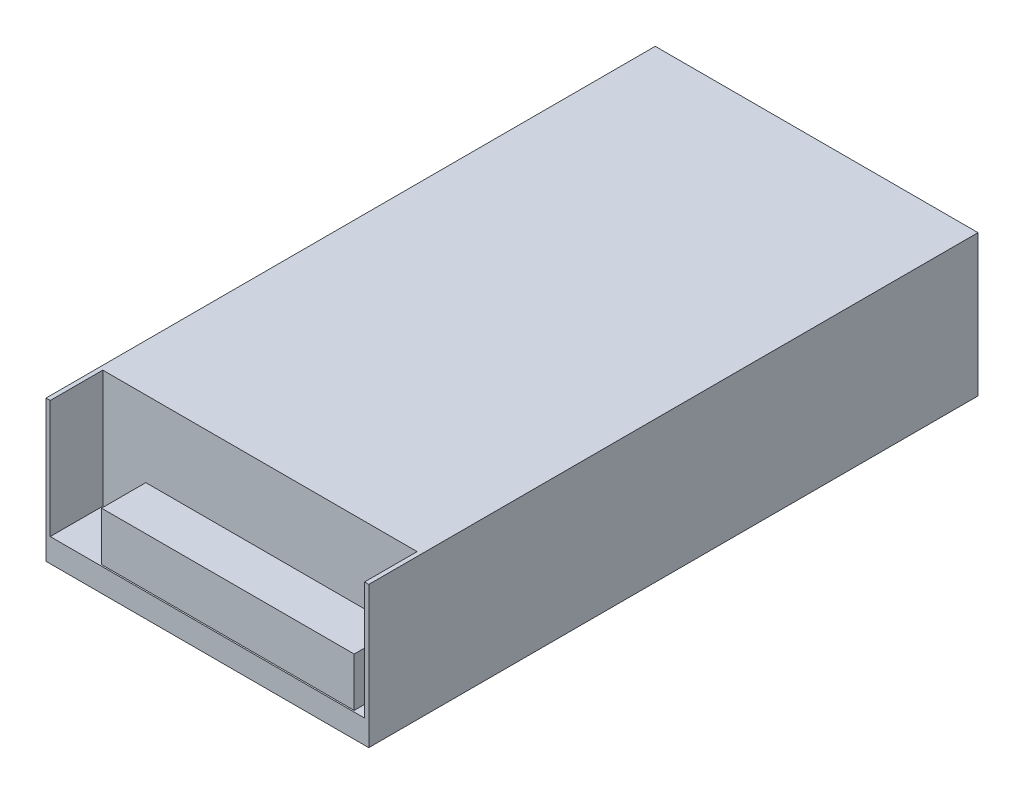
ISO-10303-21;
HEADER;
FILE_DESCRIPTION(('STEP AP214'),'2;1');
FILE_NAME('part.step','',(''),(''),'','','');
FILE_SCHEMA(('AUTOMOTIVE_DESIGN { 1 0 10303 214 1 1 1 1 }'));
ENDSEC;
DATA;
#1=APPLICATION_CONTEXT('core data for automotive mechanical design processes');
#2=APPLICATION_PROTOCOL_DEFINITION('international standard','automotive_design',2000,#1);
#3=PRODUCT_CONTEXT('',#1,'mechanical');
#4=PRODUCT('Part','Part','',(#3));
#5=PRODUCT_RELATED_PRODUCT_CATEGORY('part','',(#4));
#6=PRODUCT_DEFINITION_FORMATION('','',#4);
#7=PRODUCT_DEFINITION_CONTEXT('part definition',#1,'design');
#8=PRODUCT_DEFINITION('design','',#6,#7);
#9=PRODUCT_DEFINITION_SHAPE('','',#8);
#10=(LENGTH_UNIT() NAMED_UNIT(*) SI_UNIT(.MILLI.,.METRE.));
#11=(NAMED_UNIT(*) PLANE_ANGLE_UNIT() SI_UNIT($,.RADIAN.));
#12=(NAMED_UNIT(*) SI_UNIT($,.STERADIAN.) SOLID_ANGLE_UNIT());
#13=UNCERTAINTY_MEASURE_WITH_UNIT(LENGTH_MEASURE(1.E-05),#10,'distance_accuracy_value','');
#14=(GEOMETRIC_REPRESENTATION_CONTEXT(3) GLOBAL_UNCERTAINTY_ASSIGNED_CONTEXT((#13)) GLOBAL_UNIT_ASSIGNED_CONTEXT((#10,
#11,#12)) REPRESENTATION_CONTEXT('',''));
#15=CARTESIAN_POINT('',(0.,0.,0.));
#16=DIRECTION('',(0.,0.,1.));
#17=DIRECTION('',(1.,0.,0.));
#18=AXIS2_PLACEMENT_3D('',#15,#16,#17);
#19=CARTESIAN_POINT('',(0.,8.255,0.));
#20=DIRECTION('',(0.,-1.,0.));
#21=DIRECTION('',(0.,0.,-1.));
#22=AXIS2_PLACEMENT_3D('',#19,#20,#21);
#23=PLANE('',#22);
#24=DIRECTION('',(0.,0.,1.));
#25=VECTOR('',#24,1.);
#26=CARTESIAN_POINT('',(1.4732,8.255,0.));
#27=LINE('',#26,#25);
#28=CARTESIAN_POINT('',(1.4732,8.255,-18.415));
#29=VERTEX_POINT('',#28);
#30=CARTESIAN_POINT('',(1.4732,8.255,0.));
#31=VERTEX_POINT('',#30);
#32=EDGE_CURVE('E151',#29,#31,#27,.T.);
#33=ORIENTED_EDGE('',*,*,#32,.T.);
#34=DIRECTION('',(1.,0.,0.));
#35=VECTOR('',#34,1.);
#36=CARTESIAN_POINT('',(1.4732,8.255,0.));
#37=LINE('',#36,#35);
#38=CARTESIAN_POINT('',(111.5568,8.255,0.));
#39=VERTEX_POINT('',#38);
#40=EDGE_CURVE('E154',#31,#39,#37,.T.);
#41=ORIENTED_EDGE('',*,*,#40,.T.);
#42=DIRECTION('',(0.,0.,-1.));
#43=VECTOR('',#42,1.);
#44=CARTESIAN_POINT('',(111.5568,8.255,0.));
#45=LINE('',#44,#43);
#46=CARTESIAN_POINT('',(111.5568,8.255,-18.415));
#47=VERTEX_POINT('',#46);
#48=EDGE_CURVE('E158',#39,#47,#45,.T.);
#49=ORIENTED_EDGE('',*,*,#48,.T.);
#50=DIRECTION('',(-1.,0.,0.));
#51=VECTOR('',#50,1.);
#52=CARTESIAN_POINT('',(1.4732,8.255,-18.415));
#53=LINE('',#52,#51);
#54=EDGE_CURVE('E161',#47,#29,#53,.T.);
#55=ORIENTED_EDGE('',*,*,#54,.T.);
#56=EDGE_LOOP('',(#33,#41,#49,#55));
#57=FACE_BOUND('',#56,.T.);
#58=DIRECTION('',(0.,0.,1.));
#59=VECTOR('',#58,1.);
#60=CARTESIAN_POINT('',(18.9484,8.255,-0.508));
#61=LINE('',#60,#59);
#62=CARTESIAN_POINT('',(18.9484,8.255,-16.002));
#63=VERTEX_POINT('',#62);
#64=CARTESIAN_POINT('',(18.9484,8.255,-0.508));
#65=VERTEX_POINT('',#64);
#66=EDGE_CURVE('E142',#63,#65,#61,.T.);
#67=ORIENTED_EDGE('',*,*,#66,.F.);
#68=DIRECTION('',(-1.,0.,0.));
#69=VECTOR('',#68,1.);
#70=CARTESIAN_POINT('',(18.9484,8.255,-16.002));
#71=LINE('',#70,#69);
#72=CARTESIAN_POINT('',(107.4166,8.255,-16.002));
#73=VERTEX_POINT('',#72);
#74=EDGE_CURVE('E139',#73,#63,#71,.T.);
#75=ORIENTED_EDGE('',*,*,#74,.F.);
#76=DIRECTION('',(0.,0.,-1.));
#77=VECTOR('',#76,1.);
#78=CARTESIAN_POINT('',(107.4166,8.255,-0.508));
#79=LINE('',#78,#77);
#80=CARTESIAN_POINT('',(107.4166,8.255,-0.508));
#81=VERTEX_POINT('',#80);
#82=EDGE_CURVE('E53',#81,#73,#79,.T.);
#83=ORIENTED_EDGE('',*,*,#82,.F.);
#84=DIRECTION('',(1.,0.,0.));
#85=VECTOR('',#84,1.);
#86=CARTESIAN_POINT('',(18.9484,8.255,-0.508));
#87=LINE('',#86,#85);
#88=EDGE_CURVE('E48',#65,#81,#87,.T.);
#89=ORIENTED_EDGE('',*,*,#88,.F.);
#90=EDGE_LOOP('',(#67,#75,#83,#89));
#91=FACE_BOUND('',#90,.T.);
#92=ADVANCED_FACE('F33',(#57,#91),#23,.F.);
#93=CARTESIAN_POINT('',(0.,49.53,0.));
#94=DIRECTION('',(1.,0.,0.));
#95=DIRECTION('',(0.,0.,-1.));
#96=AXIS2_PLACEMENT_3D('',#93,#94,#95);
#97=PLANE('',#96);
#98=DIRECTION('',(0.,0.,1.));
#99=VECTOR('',#98,1.);
#100=CARTESIAN_POINT('',(0.,0.,0.));
#101=LINE('',#100,#99);
#102=CARTESIAN_POINT('',(0.,0.,-213.36));
#103=VERTEX_POINT('',#102);
#104=CARTESIAN_POINT('',(0.,0.,0.));
#105=VERTEX_POINT('',#104);
#106=EDGE_CURVE('E171',#103,#105,#101,.T.);
#107=ORIENTED_EDGE('',*,*,#106,.T.);
#108=DIRECTION('',(0.,-1.,0.));
#109=VECTOR('',#108,1.);
#110=CARTESIAN_POINT('',(0.,49.53,0.));
#111=LINE('',#110,#109);
#112=CARTESIAN_POINT('',(0.,49.53,0.));
#113=VERTEX_POINT('',#112);
#114=EDGE_CURVE('E11',#113,#105,#111,.T.);
#115=ORIENTED_EDGE('',*,*,#114,.F.);
#116=DIRECTION('',(0.,0.,1.));
#117=VECTOR('',#116,1.);
#118=CARTESIAN_POINT('',(0.,49.53,0.));
#119=LINE('',#118,#117);
#120=CARTESIAN_POINT('',(0.,49.53,-213.36));
#121=VERTEX_POINT('',#120);
#122=EDGE_CURVE('E178',#121,#113,#119,.T.);
#123=ORIENTED_EDGE('',*,*,#122,.F.);
#124=DIRECTION('',(0.,-1.,0.));
#125=VECTOR('',#124,1.);
#126=CARTESIAN_POINT('',(0.,49.53,-213.36));
#127=LINE('',#126,#125);
#128=EDGE_CURVE('E190',#121,#103,#127,.T.);
#129=ORIENTED_EDGE('',*,*,#128,.T.);
#130=EDGE_LOOP('',(#107,#115,#123,#129));
#131=FACE_BOUND('',#130,.T.);
#132=ADVANCED_FACE('F35',(#131),#97,.F.);
#133=CARTESIAN_POINT('',(0.,49.53,0.));
#134=DIRECTION('',(0.,0.,-1.));
#135=DIRECTION('',(-1.,0.,0.));
#136=AXIS2_PLACEMENT_3D('',#133,#134,#135);
#137=PLANE('',#136);
#138=ORIENTED_EDGE('',*,*,#40,.F.);
#139=DIRECTION('',(0.,1.,0.));
#140=VECTOR('',#139,1.);
#141=CARTESIAN_POINT('',(1.4732,8.255,0.));
#142=LINE('',#141,#140);
#143=CARTESIAN_POINT('',(1.4732,49.53,0.));
#144=VERTEX_POINT('',#143);
#145=EDGE_CURVE('E163',#31,#144,#142,.T.);
#146=ORIENTED_EDGE('',*,*,#145,.T.);
#147=DIRECTION('',(1.,0.,0.));
#148=VECTOR('',#147,1.);
#149=CARTESIAN_POINT('',(0.,49.53,0.));
#150=LINE('',#149,#148);
#151=EDGE_CURVE('E183',#113,#144,#150,.T.);
#152=ORIENTED_EDGE('',*,*,#151,.F.);
#153=ORIENTED_EDGE('',*,*,#114,.T.);
#154=DIRECTION('',(1.,0.,0.));
#155=VECTOR('',#154,1.);
#156=CARTESIAN_POINT('',(0.,0.,0.));
#157=LINE('',#156,#155);
#158=CARTESIAN_POINT('',(113.03,0.,0.));
#159=VERTEX_POINT('',#158);
#160=EDGE_CURVE('E193',#105,#159,#157,.T.);
#161=ORIENTED_EDGE('',*,*,#160,.T.);
#162=DIRECTION('',(0.,-1.,0.));
#163=VECTOR('',#162,1.);
#164=CARTESIAN_POINT('',(113.03,49.53,0.));
#165=LINE('',#164,#163);
#166=CARTESIAN_POINT('',(113.03,49.53,0.));
#167=VERTEX_POINT('',#166);
#168=EDGE_CURVE('E41',#167,#159,#165,.T.);
#169=ORIENTED_EDGE('',*,*,#168,.F.);
#170=CARTESIAN_POINT('',(111.5568,49.53,0.));
#171=VERTEX_POINT('',#170);
#172=EDGE_CURVE('E181',#171,#167,#150,.T.);
#173=ORIENTED_EDGE('',*,*,#172,.F.);
#174=DIRECTION('',(0.,1.,0.));
#175=VECTOR('',#174,1.);
#176=CARTESIAN_POINT('',(111.5568,8.255,0.));
#177=LINE('',#176,#175);
#178=EDGE_CURVE('E174',#39,#171,#177,.T.);
#179=ORIENTED_EDGE('',*,*,#178,.F.);
#180=EDGE_LOOP('',(#138,#146,#152,#153,#161,#169,#173,#179));
#181=FACE_BOUND('',#180,.T.);
#182=ADVANCED_FACE('F229',(#181),#137,.F.);
#183=CARTESIAN_POINT('',(113.03,49.53,0.));
#184=DIRECTION('',(-1.,0.,0.));
#185=DIRECTION('',(0.,0.,1.));
#186=AXIS2_PLACEMENT_3D('',#183,#184,#185);
#187=PLANE('',#186);
#188=DIRECTION('',(0.,0.,-1.));
#189=VECTOR('',#188,1.);
#190=CARTESIAN_POINT('',(113.03,0.,0.));
#191=LINE('',#190,#189);
#192=CARTESIAN_POINT('',(113.03,0.,-213.36));
#193=VERTEX_POINT('',#192);
#194=EDGE_CURVE('E195',#159,#193,#191,.T.);
#195=ORIENTED_EDGE('',*,*,#194,.T.);
#196=DIRECTION('',(0.,-1.,0.));
#197=VECTOR('',#196,1.);
#198=CARTESIAN_POINT('',(113.03,49.53,-213.36));
#199=LINE('',#198,#197);
#200=CARTESIAN_POINT('',(113.03,49.53,-213.36));
#201=VERTEX_POINT('',#200);
#202=EDGE_CURVE('E200',#201,#193,#199,.T.);
#203=ORIENTED_EDGE('',*,*,#202,.F.);
#204=DIRECTION('',(0.,0.,-1.));
#205=VECTOR('',#204,1.);
#206=CARTESIAN_POINT('',(113.03,49.53,0.));
#207=LINE('',#206,#205);
#208=EDGE_CURVE('E186',#167,#201,#207,.T.);
#209=ORIENTED_EDGE('',*,*,#208,.F.);
#210=ORIENTED_EDGE('',*,*,#168,.T.);
#211=EDGE_LOOP('',(#195,#203,#209,#210));
#212=FACE_BOUND('',#211,.T.);
#213=ADVANCED_FACE('F207',(#212),#187,.F.);
#214=CARTESIAN_POINT('',(0.,49.53,-213.36));
#215=DIRECTION('',(0.,0.,1.));
#216=DIRECTION('',(1.,0.,0.));
#217=AXIS2_PLACEMENT_3D('',#214,#215,#216);
#218=PLANE('',#217);
#219=DIRECTION('',(-1.,0.,0.));
#220=VECTOR('',#219,1.);
#221=CARTESIAN_POINT('',(0.,0.,-213.36));
#222=LINE('',#221,#220);
#223=EDGE_CURVE('E182',#193,#103,#222,.T.);
#224=ORIENTED_EDGE('',*,*,#223,.T.);
#225=ORIENTED_EDGE('',*,*,#128,.F.);
#226=DIRECTION('',(-1.,0.,0.));
#227=VECTOR('',#226,1.);
#228=CARTESIAN_POINT('',(0.,49.53,-213.36));
#229=LINE('',#228,#227);
#230=EDGE_CURVE('E188',#201,#121,#229,.T.);
#231=ORIENTED_EDGE('',*,*,#230,.F.);
#232=ORIENTED_EDGE('',*,*,#202,.T.);
#233=EDGE_LOOP('',(#224,#225,#231,#232));
#234=FACE_BOUND('',#233,.T.);
#235=ADVANCED_FACE('F217',(#234),#218,.F.);
#236=CARTESIAN_POINT('',(0.,49.53,0.));
#237=DIRECTION('',(0.,-1.,0.));
#238=DIRECTION('',(0.,0.,-1.));
#239=AXIS2_PLACEMENT_3D('',#236,#237,#238);
#240=PLANE('',#239);
#241=ORIENTED_EDGE('',*,*,#151,.T.);
#242=DIRECTION('',(0.,0.,1.));
#243=VECTOR('',#242,1.);
#244=CARTESIAN_POINT('',(1.4732,49.53,0.));
#245=LINE('',#244,#243);
#246=CARTESIAN_POINT('',(1.4732,49.53,-18.415));
#247=VERTEX_POINT('',#246);
#248=EDGE_CURVE('E143',#247,#144,#245,.T.);
#249=ORIENTED_EDGE('',*,*,#248,.F.);
#250=DIRECTION('',(-1.,0.,0.));
#251=VECTOR('',#250,1.);
#252=CARTESIAN_POINT('',(1.4732,49.53,-18.415));
#253=LINE('',#252,#251);
#254=CARTESIAN_POINT('',(111.5568,49.53,-18.415));
#255=VERTEX_POINT('',#254);
#256=EDGE_CURVE('E155',#255,#247,#253,.T.);
#257=ORIENTED_EDGE('',*,*,#256,.F.);
#258=DIRECTION('',(0.,0.,-1.));
#259=VECTOR('',#258,1.);
#260=CARTESIAN_POINT('',(111.5568,49.53,0.));
#261=LINE('',#260,#259);
#262=EDGE_CURVE('E145',#171,#255,#261,.T.);
#263=ORIENTED_EDGE('',*,*,#262,.F.);
#264=ORIENTED_EDGE('',*,*,#172,.T.);
#265=ORIENTED_EDGE('',*,*,#208,.T.);
#266=ORIENTED_EDGE('',*,*,#230,.T.);
#267=ORIENTED_EDGE('',*,*,#122,.T.);
#268=EDGE_LOOP('',(#241,#249,#257,#263,#264,#265,#266,#267));
#269=FACE_BOUND('',#268,.T.);
#270=ADVANCED_FACE('F223',(#269),#240,.F.);
#271=CARTESIAN_POINT('',(0.,0.,0.));
#272=DIRECTION('',(0.,-1.,0.));
#273=DIRECTION('',(0.,0.,-1.));
#274=AXIS2_PLACEMENT_3D('',#271,#272,#273);
#275=PLANE('',#274);
#276=CARTESIAN_POINT('',(31.515,0.,-180.86));
#277=DIRECTION('',(0.,-1.,0.));
#278=DIRECTION('',(0.,0.,-1.));
#279=AXIS2_PLACEMENT_3D('',#276,#277,#278);
#280=CIRCLE('',#279,1.5875);
#281=CARTESIAN_POINT('',(31.515,0.,-182.4475));
#282=VERTEX_POINT('',#281);
#283=EDGE_CURVE('E304',#282,#282,#280,.T.);
#284=ORIENTED_EDGE('',*,*,#283,.F.);
#285=EDGE_LOOP('',(#284));
#286=FACE_BOUND('',#285,.T.);
#287=CARTESIAN_POINT('',(81.515,0.,-30.86));
#288=DIRECTION('',(0.,-1.,0.));
#289=DIRECTION('',(0.,0.,-1.));
#290=AXIS2_PLACEMENT_3D('',#287,#288,#289);
#291=CIRCLE('',#290,1.58749999999999);
#292=CARTESIAN_POINT('',(81.515,0.,-32.4475));
#293=VERTEX_POINT('',#292);
#294=EDGE_CURVE('E315',#293,#293,#291,.T.);
#295=ORIENTED_EDGE('',*,*,#294,.F.);
#296=EDGE_LOOP('',(#295));
#297=FACE_BOUND('',#296,.T.);
#298=CARTESIAN_POINT('',(31.515,0.,-30.86));
#299=DIRECTION('',(0.,-1.,0.));
#300=DIRECTION('',(0.,0.,-1.));
#301=AXIS2_PLACEMENT_3D('',#298,#299,#300);
#302=CIRCLE('',#301,1.5875);
#303=CARTESIAN_POINT('',(31.515,0.,-32.4475));
#304=VERTEX_POINT('',#303);
#305=EDGE_CURVE('E321',#304,#304,#302,.T.);
#306=ORIENTED_EDGE('',*,*,#305,.F.);
#307=EDGE_LOOP('',(#306));
#308=FACE_BOUND('',#307,.T.);
#309=CARTESIAN_POINT('',(81.515,0.,-180.86));
#310=DIRECTION('',(0.,-1.,0.));
#311=DIRECTION('',(0.,0.,-1.));
#312=AXIS2_PLACEMENT_3D('',#309,#310,#311);
#313=CIRCLE('',#312,1.5875);
#314=CARTESIAN_POINT('',(81.515,0.,-182.4475));
#315=VERTEX_POINT('',#314);
#316=EDGE_CURVE('E303',#315,#315,#313,.T.);
#317=ORIENTED_EDGE('',*,*,#316,.F.);
#318=EDGE_LOOP('',(#317));
#319=FACE_BOUND('',#318,.T.);
#320=ORIENTED_EDGE('',*,*,#106,.F.);
#321=ORIENTED_EDGE('',*,*,#223,.F.);
#322=ORIENTED_EDGE('',*,*,#194,.F.);
#323=ORIENTED_EDGE('',*,*,#160,.F.);
#324=EDGE_LOOP('',(#320,#321,#322,#323));
#325=FACE_BOUND('',#324,.T.);
#326=ADVANCED_FACE('F214',(#286,#297,#308,#319,#325),#275,.T.);
#327=CARTESIAN_POINT('',(1.4732,8.255,0.));
#328=DIRECTION('',(-1.,0.,0.));
#329=DIRECTION('',(0.,0.,1.));
#330=AXIS2_PLACEMENT_3D('',#327,#328,#329);
#331=PLANE('',#330);
#332=ORIENTED_EDGE('',*,*,#248,.T.);
#333=ORIENTED_EDGE('',*,*,#145,.F.);
#334=ORIENTED_EDGE('',*,*,#32,.F.);
#335=DIRECTION('',(0.,1.,0.));
#336=VECTOR('',#335,1.);
#337=CARTESIAN_POINT('',(1.4732,8.255,-18.415));
#338=LINE('',#337,#336);
#339=EDGE_CURVE('E169',#29,#247,#338,.T.);
#340=ORIENTED_EDGE('',*,*,#339,.T.);
#341=EDGE_LOOP('',(#332,#333,#334,#340));
#342=FACE_BOUND('',#341,.T.);
#343=ADVANCED_FACE('F236',(#342),#331,.F.);
#344=CARTESIAN_POINT('',(1.4732,8.255,-18.415));
#345=DIRECTION('',(0.,0.,-1.));
#346=DIRECTION('',(-1.,0.,0.));
#347=AXIS2_PLACEMENT_3D('',#344,#345,#346);
#348=PLANE('',#347);
#349=ORIENTED_EDGE('',*,*,#256,.T.);
#350=ORIENTED_EDGE('',*,*,#339,.F.);
#351=ORIENTED_EDGE('',*,*,#54,.F.);
#352=DIRECTION('',(0.,1.,0.));
#353=VECTOR('',#352,1.);
#354=CARTESIAN_POINT('',(111.5568,8.255,-18.415));
#355=LINE('',#354,#353);
#356=EDGE_CURVE('E172',#47,#255,#355,.T.);
#357=ORIENTED_EDGE('',*,*,#356,.T.);
#358=EDGE_LOOP('',(#349,#350,#351,#357));
#359=FACE_BOUND('',#358,.T.);
#360=ADVANCED_FACE('F238',(#359),#348,.F.);
#361=CARTESIAN_POINT('',(111.5568,8.255,0.));
#362=DIRECTION('',(1.,0.,0.));
#363=DIRECTION('',(0.,0.,-1.));
#364=AXIS2_PLACEMENT_3D('',#361,#362,#363);
#365=PLANE('',#364);
#366=ORIENTED_EDGE('',*,*,#262,.T.);
#367=ORIENTED_EDGE('',*,*,#356,.F.);
#368=ORIENTED_EDGE('',*,*,#48,.F.);
#369=ORIENTED_EDGE('',*,*,#178,.T.);
#370=EDGE_LOOP('',(#366,#367,#368,#369));
#371=FACE_BOUND('',#370,.T.);
#372=ADVANCED_FACE('F231',(#371),#365,.F.);
#373=CARTESIAN_POINT('',(18.9484,25.3492,-0.508));
#374=DIRECTION('',(1.,0.,0.));
#375=DIRECTION('',(0.,0.,-1.));
#376=AXIS2_PLACEMENT_3D('',#373,#374,#375);
#377=PLANE('',#376);
#378=ORIENTED_EDGE('',*,*,#66,.T.);
#379=DIRECTION('',(0.,-1.,0.));
#380=VECTOR('',#379,1.);
#381=CARTESIAN_POINT('',(18.9484,25.3492,-0.508));
#382=LINE('',#381,#380);
#383=CARTESIAN_POINT('',(18.9484,25.3492,-0.508));
#384=VERTEX_POINT('',#383);
#385=EDGE_CURVE('E123',#384,#65,#382,.T.);
#386=ORIENTED_EDGE('',*,*,#385,.F.);
#387=DIRECTION('',(0.,0.,1.));
#388=VECTOR('',#387,1.);
#389=CARTESIAN_POINT('',(18.9484,25.3492,-0.508));
#390=LINE('',#389,#388);
#391=CARTESIAN_POINT('',(18.9484,25.3492,-16.002));
#392=VERTEX_POINT('',#391);
#393=EDGE_CURVE('E130',#392,#384,#390,.T.);
#394=ORIENTED_EDGE('',*,*,#393,.F.);
#395=DIRECTION('',(0.,-1.,0.));
#396=VECTOR('',#395,1.);
#397=CARTESIAN_POINT('',(18.9484,25.3492,-16.002));
#398=LINE('',#397,#396);
#399=EDGE_CURVE('E328',#392,#63,#398,.T.);
#400=ORIENTED_EDGE('',*,*,#399,.T.);
#401=EDGE_LOOP('',(#378,#386,#394,#400));
#402=FACE_BOUND('',#401,.T.);
#403=ADVANCED_FACE('F141',(#402),#377,.F.);
#404=CARTESIAN_POINT('',(18.9484,25.3492,-0.508));
#405=DIRECTION('',(0.,0.,-1.));
#406=DIRECTION('',(-1.,0.,0.));
#407=AXIS2_PLACEMENT_3D('',#404,#405,#406);
#408=PLANE('',#407);
#409=ORIENTED_EDGE('',*,*,#88,.T.);
#410=DIRECTION('',(0.,-1.,0.));
#411=VECTOR('',#410,1.);
#412=CARTESIAN_POINT('',(107.4166,25.3492,-0.508));
#413=LINE('',#412,#411);
#414=CARTESIAN_POINT('',(107.4166,25.3492,-0.508));
#415=VERTEX_POINT('',#414);
#416=EDGE_CURVE('E126',#415,#81,#413,.T.);
#417=ORIENTED_EDGE('',*,*,#416,.F.);
#418=DIRECTION('',(1.,0.,0.));
#419=VECTOR('',#418,1.);
#420=CARTESIAN_POINT('',(18.9484,25.3492,-0.508));
#421=LINE('',#420,#419);
#422=EDGE_CURVE('E119',#384,#415,#421,.T.);
#423=ORIENTED_EDGE('',*,*,#422,.F.);
#424=ORIENTED_EDGE('',*,*,#385,.T.);
#425=EDGE_LOOP('',(#409,#417,#423,#424));
#426=FACE_BOUND('',#425,.T.);
#427=ADVANCED_FACE('F121',(#426),#408,.F.);
#428=CARTESIAN_POINT('',(107.4166,25.3492,-0.508));
#429=DIRECTION('',(-1.,0.,0.));
#430=DIRECTION('',(0.,0.,1.));
#431=AXIS2_PLACEMENT_3D('',#428,#429,#430);
#432=PLANE('',#431);
#433=ORIENTED_EDGE('',*,*,#82,.T.);
#434=DIRECTION('',(0.,-1.,0.));
#435=VECTOR('',#434,1.);
#436=CARTESIAN_POINT('',(107.4166,25.3492,-16.002));
#437=LINE('',#436,#435);
#438=CARTESIAN_POINT('',(107.4166,25.3492,-16.002));
#439=VERTEX_POINT('',#438);
#440=EDGE_CURVE('E147',#439,#73,#437,.T.);
#441=ORIENTED_EDGE('',*,*,#440,.F.);
#442=DIRECTION('',(0.,0.,-1.));
#443=VECTOR('',#442,1.);
#444=CARTESIAN_POINT('',(107.4166,25.3492,-0.508));
#445=LINE('',#444,#443);
#446=EDGE_CURVE('E129',#415,#439,#445,.T.);
#447=ORIENTED_EDGE('',*,*,#446,.F.);
#448=ORIENTED_EDGE('',*,*,#416,.T.);
#449=EDGE_LOOP('',(#433,#441,#447,#448));
#450=FACE_BOUND('',#449,.T.);
#451=ADVANCED_FACE('F257',(#450),#432,.F.);
#452=CARTESIAN_POINT('',(18.9484,25.3492,-16.002));
#453=DIRECTION('',(0.,0.,1.));
#454=DIRECTION('',(1.,0.,0.));
#455=AXIS2_PLACEMENT_3D('',#452,#453,#454);
#456=PLANE('',#455);
#457=ORIENTED_EDGE('',*,*,#74,.T.);
#458=ORIENTED_EDGE('',*,*,#399,.F.);
#459=DIRECTION('',(-1.,0.,0.));
#460=VECTOR('',#459,1.);
#461=CARTESIAN_POINT('',(18.9484,25.3492,-16.002));
#462=LINE('',#461,#460);
#463=EDGE_CURVE('E135',#439,#392,#462,.T.);
#464=ORIENTED_EDGE('',*,*,#463,.F.);
#465=ORIENTED_EDGE('',*,*,#440,.T.);
#466=EDGE_LOOP('',(#457,#458,#464,#465));
#467=FACE_BOUND('',#466,.T.);
#468=ADVANCED_FACE('F260',(#467),#456,.F.);
#469=CARTESIAN_POINT('',(0.,25.3492,0.));
#470=DIRECTION('',(0.,-1.,0.));
#471=DIRECTION('',(0.,0.,-1.));
#472=AXIS2_PLACEMENT_3D('',#469,#470,#471);
#473=PLANE('',#472);
#474=ORIENTED_EDGE('',*,*,#393,.T.);
#475=ORIENTED_EDGE('',*,*,#422,.T.);
#476=ORIENTED_EDGE('',*,*,#446,.T.);
#477=ORIENTED_EDGE('',*,*,#463,.T.);
#478=EDGE_LOOP('',(#474,#475,#476,#477));
#479=FACE_BOUND('',#478,.T.);
#480=ADVANCED_FACE('F133',(#479),#473,.F.);
#481=CARTESIAN_POINT('',(81.515,5.,-180.86));
#482=DIRECTION('',(0.,-1.,0.));
#483=DIRECTION('',(0.,0.,-1.));
#484=AXIS2_PLACEMENT_3D('',#481,#482,#483);
#485=CYLINDRICAL_SURFACE('',#484,1.5875);
#486=CARTESIAN_POINT('',(81.515,5.,-180.86));
#487=DIRECTION('',(0.,-1.,0.));
#488=DIRECTION('',(0.,0.,-1.));
#489=AXIS2_PLACEMENT_3D('',#486,#487,#488);
#490=CIRCLE('',#489,1.5875);
#491=CARTESIAN_POINT('',(81.515,5.,-182.4475));
#492=VERTEX_POINT('',#491);
#493=EDGE_CURVE('E307',#492,#492,#490,.T.);
#494=ORIENTED_EDGE('',*,*,#493,.F.);
#495=EDGE_LOOP('',(#494));
#496=FACE_BOUND('',#495,.T.);
#497=ORIENTED_EDGE('',*,*,#316,.T.);
#498=EDGE_LOOP('',(#497));
#499=FACE_BOUND('',#498,.T.);
#500=ADVANCED_FACE('F267',(#496,#499),#485,.F.);
#501=CARTESIAN_POINT('',(81.515,5.,-180.86));
#502=DIRECTION('',(0.,-1.,0.));
#503=DIRECTION('',(0.,0.,-1.));
#504=AXIS2_PLACEMENT_3D('',#501,#502,#503);
#505=PLANE('',#504);
#506=ORIENTED_EDGE('',*,*,#493,.T.);
#507=EDGE_LOOP('',(#506));
#508=FACE_BOUND('',#507,.T.);
#509=ADVANCED_FACE('F270',(#508),#505,.T.);
#510=CARTESIAN_POINT('',(31.515,5.,-30.86));
#511=DIRECTION('',(0.,-1.,0.));
#512=DIRECTION('',(0.,0.,-1.));
#513=AXIS2_PLACEMENT_3D('',#510,#511,#512);
#514=CYLINDRICAL_SURFACE('',#513,1.5875);
#515=CARTESIAN_POINT('',(31.515,5.,-30.86));
#516=DIRECTION('',(0.,-1.,0.));
#517=DIRECTION('',(0.,0.,-1.));
#518=AXIS2_PLACEMENT_3D('',#515,#516,#517);
#519=CIRCLE('',#518,1.5875);
#520=CARTESIAN_POINT('',(31.515,5.,-32.4475));
#521=VERTEX_POINT('',#520);
#522=EDGE_CURVE('E318',#521,#521,#519,.T.);
#523=ORIENTED_EDGE('',*,*,#522,.F.);
#524=EDGE_LOOP('',(#523));
#525=FACE_BOUND('',#524,.T.);
#526=ORIENTED_EDGE('',*,*,#305,.T.);
#527=EDGE_LOOP('',(#526));
#528=FACE_BOUND('',#527,.T.);
#529=ADVANCED_FACE('F274',(#525,#528),#514,.F.);
#530=CARTESIAN_POINT('',(31.515,5.,-30.86));
#531=DIRECTION('',(0.,-1.,0.));
#532=DIRECTION('',(0.,0.,-1.));
#533=AXIS2_PLACEMENT_3D('',#530,#531,#532);
#534=PLANE('',#533);
#535=ORIENTED_EDGE('',*,*,#522,.T.);
#536=EDGE_LOOP('',(#535));
#537=FACE_BOUND('',#536,.T.);
#538=ADVANCED_FACE('F278',(#537),#534,.T.);
#539=CARTESIAN_POINT('',(81.515,5.,-30.86));
#540=DIRECTION('',(0.,-1.,0.));
#541=DIRECTION('',(0.,0.,-1.));
#542=AXIS2_PLACEMENT_3D('',#539,#540,#541);
#543=CYLINDRICAL_SURFACE('',#542,1.58749999999999);
#544=CARTESIAN_POINT('',(81.515,5.,-30.86));
#545=DIRECTION('',(0.,-1.,0.));
#546=DIRECTION('',(0.,0.,-1.));
#547=AXIS2_PLACEMENT_3D('',#544,#545,#546);
#548=CIRCLE('',#547,1.58749999999999);
#549=CARTESIAN_POINT('',(81.515,5.,-32.4475));
#550=VERTEX_POINT('',#549);
#551=EDGE_CURVE('E310',#550,#550,#548,.T.);
#552=ORIENTED_EDGE('',*,*,#551,.F.);
#553=EDGE_LOOP('',(#552));
#554=FACE_BOUND('',#553,.T.);
#555=ORIENTED_EDGE('',*,*,#294,.T.);
#556=EDGE_LOOP('',(#555));
#557=FACE_BOUND('',#556,.T.);
#558=ADVANCED_FACE('F282',(#554,#557),#543,.F.);
#559=CARTESIAN_POINT('',(81.515,5.,-30.86));
#560=DIRECTION('',(0.,-1.,0.));
#561=DIRECTION('',(0.,0.,-1.));
#562=AXIS2_PLACEMENT_3D('',#559,#560,#561);
#563=PLANE('',#562);
#564=ORIENTED_EDGE('',*,*,#551,.T.);
#565=EDGE_LOOP('',(#564));
#566=FACE_BOUND('',#565,.T.);
#567=ADVANCED_FACE('F286',(#566),#563,.T.);
#568=CARTESIAN_POINT('',(31.515,5.,-180.86));
#569=DIRECTION('',(0.,-1.,0.));
#570=DIRECTION('',(0.,0.,-1.));
#571=AXIS2_PLACEMENT_3D('',#568,#569,#570);
#572=CYLINDRICAL_SURFACE('',#571,1.5875);
#573=CARTESIAN_POINT('',(31.515,5.,-180.86));
#574=DIRECTION('',(0.,-1.,0.));
#575=DIRECTION('',(0.,0.,-1.));
#576=AXIS2_PLACEMENT_3D('',#573,#574,#575);
#577=CIRCLE('',#576,1.5875);
#578=CARTESIAN_POINT('',(31.515,5.,-182.4475));
#579=VERTEX_POINT('',#578);
#580=EDGE_CURVE('E302',#579,#579,#577,.T.);
#581=ORIENTED_EDGE('',*,*,#580,.F.);
#582=EDGE_LOOP('',(#581));
#583=FACE_BOUND('',#582,.T.);
#584=ORIENTED_EDGE('',*,*,#283,.T.);
#585=EDGE_LOOP('',(#584));
#586=FACE_BOUND('',#585,.T.);
#587=ADVANCED_FACE('F290',(#583,#586),#572,.F.);
#588=CARTESIAN_POINT('',(31.515,5.,-180.86));
#589=DIRECTION('',(0.,-1.,0.));
#590=DIRECTION('',(0.,0.,-1.));
#591=AXIS2_PLACEMENT_3D('',#588,#589,#590);
#592=PLANE('',#591);
#593=ORIENTED_EDGE('',*,*,#580,.T.);
#594=EDGE_LOOP('',(#593));
#595=FACE_BOUND('',#594,.T.);
#596=ADVANCED_FACE('F294',(#595),#592,.T.);
#597=CLOSED_SHELL('',(#92,#132,#182,#213,#235,#270,#326,#343,#360,#372,#403,#427,#451,#468,#480,
#500,#509,#529,#538,#558,#567,#587,#596));
#598=MANIFOLD_SOLID_BREP('B2',#597);
#599=ADVANCED_BREP_SHAPE_REPRESENTATION('',(#18,#598),#14);
#600=SHAPE_DEFINITION_REPRESENTATION(#9,#599);
ENDSEC;
END-ISO-10303-21;
